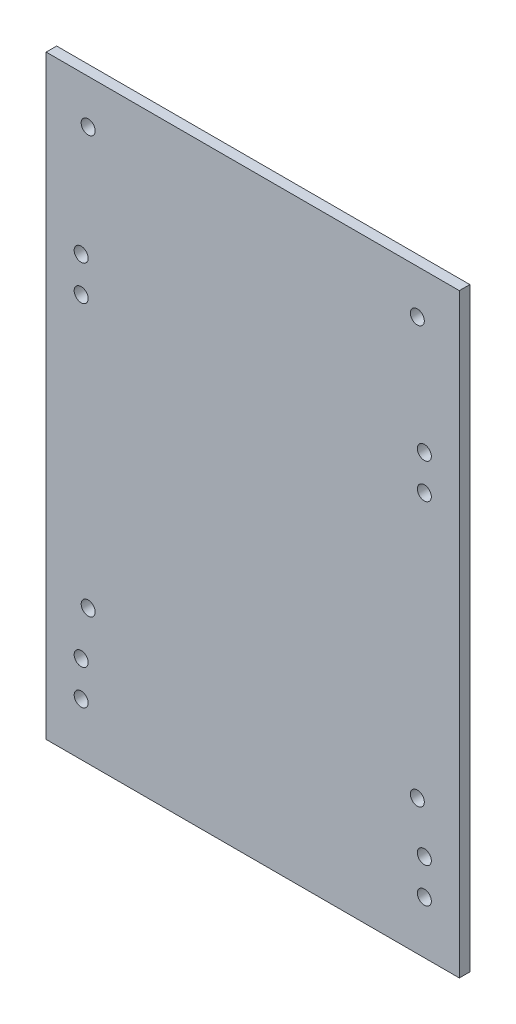
ISO-10303-21;
HEADER;
FILE_DESCRIPTION(('STEP AP214'),'2;1');
FILE_NAME('part.step','',(''),(''),'','','');
FILE_SCHEMA(('AUTOMOTIVE_DESIGN { 1 0 10303 214 1 1 1 1 }'));
ENDSEC;
DATA;
#1=APPLICATION_CONTEXT('core data for automotive mechanical design processes');
#2=APPLICATION_PROTOCOL_DEFINITION('international standard','automotive_design',2000,#1);
#3=PRODUCT_CONTEXT('',#1,'mechanical');
#4=PRODUCT('Part','Part','',(#3));
#5=PRODUCT_RELATED_PRODUCT_CATEGORY('part','',(#4));
#6=PRODUCT_DEFINITION_FORMATION('','',#4);
#7=PRODUCT_DEFINITION_CONTEXT('part definition',#1,'design');
#8=PRODUCT_DEFINITION('design','',#6,#7);
#9=PRODUCT_DEFINITION_SHAPE('','',#8);
#10=(LENGTH_UNIT() NAMED_UNIT(*) SI_UNIT(.MILLI.,.METRE.));
#11=(NAMED_UNIT(*) PLANE_ANGLE_UNIT() SI_UNIT($,.RADIAN.));
#12=(NAMED_UNIT(*) SI_UNIT($,.STERADIAN.) SOLID_ANGLE_UNIT());
#13=UNCERTAINTY_MEASURE_WITH_UNIT(LENGTH_MEASURE(1.E-05),#10,'distance_accuracy_value','');
#14=(GEOMETRIC_REPRESENTATION_CONTEXT(3) GLOBAL_UNCERTAINTY_ASSIGNED_CONTEXT((#13)) GLOBAL_UNIT_ASSIGNED_CONTEXT((#10,
#11,#12)) REPRESENTATION_CONTEXT('',''));
#15=CARTESIAN_POINT('',(0.,0.,0.));
#16=DIRECTION('',(0.,0.,1.));
#17=DIRECTION('',(1.,0.,0.));
#18=AXIS2_PLACEMENT_3D('',#15,#16,#17);
#19=CARTESIAN_POINT('',(0.,0.,3.));
#20=DIRECTION('',(0.,0.,1.));
#21=DIRECTION('',(1.,0.,0.));
#22=AXIS2_PLACEMENT_3D('',#19,#20,#21);
#23=PLANE('',#22);
#24=CARTESIAN_POINT('',(47.,-31.5,3.));
#25=DIRECTION('',(0.,0.,1.));
#26=DIRECTION('',(1.,0.,0.));
#27=AXIS2_PLACEMENT_3D('',#24,#25,#26);
#28=CIRCLE('',#27,2.);
#29=CARTESIAN_POINT('',(49.,-31.5,3.));
#30=VERTEX_POINT('',#29);
#31=EDGE_CURVE('E168',#30,#30,#28,.T.);
#32=ORIENTED_EDGE('',*,*,#31,.F.);
#33=EDGE_LOOP('',(#32));
#34=FACE_BOUND('',#33,.T.);
#35=CARTESIAN_POINT('',(-47.,87.5,3.));
#36=DIRECTION('',(0.,0.,1.));
#37=DIRECTION('',(1.,0.,0.));
#38=AXIS2_PLACEMENT_3D('',#35,#36,#37);
#39=CIRCLE('',#38,2.);
#40=CARTESIAN_POINT('',(-45.,87.5,3.));
#41=VERTEX_POINT('',#40);
#42=EDGE_CURVE('E156',#41,#41,#39,.T.);
#43=ORIENTED_EDGE('',*,*,#42,.F.);
#44=EDGE_LOOP('',(#43));
#45=FACE_BOUND('',#44,.T.);
#46=CARTESIAN_POINT('',(-49.,-45.,3.));
#47=DIRECTION('',(0.,0.,1.));
#48=DIRECTION('',(-1.,0.,0.));
#49=AXIS2_PLACEMENT_3D('',#46,#47,#48);
#50=CIRCLE('',#49,2.);
#51=CARTESIAN_POINT('',(-51.,-45.,3.));
#52=VERTEX_POINT('',#51);
#53=EDGE_CURVE('E144',#52,#52,#50,.T.);
#54=ORIENTED_EDGE('',*,*,#53,.F.);
#55=EDGE_LOOP('',(#54));
#56=FACE_BOUND('',#55,.T.);
#57=CARTESIAN_POINT('',(49.,-45.,3.));
#58=DIRECTION('',(0.,0.,1.));
#59=DIRECTION('',(1.,0.,0.));
#60=AXIS2_PLACEMENT_3D('',#57,#58,#59);
#61=CIRCLE('',#60,2.);
#62=CARTESIAN_POINT('',(51.,-45.,3.));
#63=VERTEX_POINT('',#62);
#64=EDGE_CURVE('E132',#63,#63,#61,.T.);
#65=ORIENTED_EDGE('',*,*,#64,.F.);
#66=EDGE_LOOP('',(#65));
#67=FACE_BOUND('',#66,.T.);
#68=CARTESIAN_POINT('',(49.,45.,3.));
#69=DIRECTION('',(0.,0.,1.));
#70=DIRECTION('',(-1.,0.,0.));
#71=AXIS2_PLACEMENT_3D('',#68,#69,#70);
#72=CIRCLE('',#71,2.);
#73=CARTESIAN_POINT('',(47.,45.,3.));
#74=VERTEX_POINT('',#73);
#75=EDGE_CURVE('E120',#74,#74,#72,.T.);
#76=ORIENTED_EDGE('',*,*,#75,.F.);
#77=EDGE_LOOP('',(#76));
#78=FACE_BOUND('',#77,.T.);
#79=CARTESIAN_POINT('',(-49.,55.,3.));
#80=DIRECTION('',(0.,0.,1.));
#81=DIRECTION('',(1.,0.,0.));
#82=AXIS2_PLACEMENT_3D('',#79,#80,#81);
#83=CIRCLE('',#82,2.);
#84=CARTESIAN_POINT('',(-47.,55.,3.));
#85=VERTEX_POINT('',#84);
#86=EDGE_CURVE('E99',#85,#85,#83,.T.);
#87=ORIENTED_EDGE('',*,*,#86,.F.);
#88=EDGE_LOOP('',(#87));
#89=FACE_BOUND('',#88,.T.);
#90=DIRECTION('',(0.,-1.,0.));
#91=VECTOR('',#90,1.);
#92=CARTESIAN_POINT('',(-59.,100.,3.));
#93=LINE('',#92,#91);
#94=CARTESIAN_POINT('',(-59.,100.,3.));
#95=VERTEX_POINT('',#94);
#96=CARTESIAN_POINT('',(-59.,-70.,3.));
#97=VERTEX_POINT('',#96);
#98=EDGE_CURVE('E84',#95,#97,#93,.T.);
#99=ORIENTED_EDGE('',*,*,#98,.T.);
#100=DIRECTION('',(1.,0.,0.));
#101=VECTOR('',#100,1.);
#102=CARTESIAN_POINT('',(-59.,-70.,3.));
#103=LINE('',#102,#101);
#104=CARTESIAN_POINT('',(59.,-70.,3.));
#105=VERTEX_POINT('',#104);
#106=EDGE_CURVE('E79',#97,#105,#103,.T.);
#107=ORIENTED_EDGE('',*,*,#106,.T.);
#108=DIRECTION('',(0.,1.,0.));
#109=VECTOR('',#108,1.);
#110=CARTESIAN_POINT('',(59.,100.,3.));
#111=LINE('',#110,#109);
#112=CARTESIAN_POINT('',(59.,100.,3.));
#113=VERTEX_POINT('',#112);
#114=EDGE_CURVE('E82',#105,#113,#111,.T.);
#115=ORIENTED_EDGE('',*,*,#114,.T.);
#116=DIRECTION('',(-1.,0.,0.));
#117=VECTOR('',#116,1.);
#118=CARTESIAN_POINT('',(-59.,100.,3.));
#119=LINE('',#118,#117);
#120=EDGE_CURVE('E49',#113,#95,#119,.T.);
#121=ORIENTED_EDGE('',*,*,#120,.T.);
#122=EDGE_LOOP('',(#99,#107,#115,#121));
#123=FACE_BOUND('',#122,.T.);
#124=CARTESIAN_POINT('',(-49.,45.,3.));
#125=DIRECTION('',(0.,0.,1.));
#126=DIRECTION('',(1.,0.,0.));
#127=AXIS2_PLACEMENT_3D('',#124,#125,#126);
#128=CIRCLE('',#127,2.);
#129=CARTESIAN_POINT('',(-47.,45.,3.));
#130=VERTEX_POINT('',#129);
#131=EDGE_CURVE('E114',#130,#130,#128,.T.);
#132=ORIENTED_EDGE('',*,*,#131,.F.);
#133=EDGE_LOOP('',(#132));
#134=FACE_BOUND('',#133,.T.);
#135=CARTESIAN_POINT('',(49.,55.,3.));
#136=DIRECTION('',(0.,0.,1.));
#137=DIRECTION('',(-1.,0.,0.));
#138=AXIS2_PLACEMENT_3D('',#135,#136,#137);
#139=CIRCLE('',#138,2.);
#140=CARTESIAN_POINT('',(47.,55.,3.));
#141=VERTEX_POINT('',#140);
#142=EDGE_CURVE('E126',#141,#141,#139,.T.);
#143=ORIENTED_EDGE('',*,*,#142,.F.);
#144=EDGE_LOOP('',(#143));
#145=FACE_BOUND('',#144,.T.);
#146=CARTESIAN_POINT('',(49.,-55.,3.));
#147=DIRECTION('',(0.,0.,1.));
#148=DIRECTION('',(1.,0.,0.));
#149=AXIS2_PLACEMENT_3D('',#146,#147,#148);
#150=CIRCLE('',#149,2.);
#151=CARTESIAN_POINT('',(51.,-55.,3.));
#152=VERTEX_POINT('',#151);
#153=EDGE_CURVE('E138',#152,#152,#150,.T.);
#154=ORIENTED_EDGE('',*,*,#153,.F.);
#155=EDGE_LOOP('',(#154));
#156=FACE_BOUND('',#155,.T.);
#157=CARTESIAN_POINT('',(-49.,-55.,3.));
#158=DIRECTION('',(0.,0.,1.));
#159=DIRECTION('',(-1.,0.,0.));
#160=AXIS2_PLACEMENT_3D('',#157,#158,#159);
#161=CIRCLE('',#160,2.);
#162=CARTESIAN_POINT('',(-51.,-55.,3.));
#163=VERTEX_POINT('',#162);
#164=EDGE_CURVE('E150',#163,#163,#161,.T.);
#165=ORIENTED_EDGE('',*,*,#164,.F.);
#166=EDGE_LOOP('',(#165));
#167=FACE_BOUND('',#166,.T.);
#168=CARTESIAN_POINT('',(47.,87.5,3.));
#169=DIRECTION('',(0.,0.,1.));
#170=DIRECTION('',(-1.,0.,0.));
#171=AXIS2_PLACEMENT_3D('',#168,#169,#170);
#172=CIRCLE('',#171,2.);
#173=CARTESIAN_POINT('',(45.,87.5,3.));
#174=VERTEX_POINT('',#173);
#175=EDGE_CURVE('E162',#174,#174,#172,.T.);
#176=ORIENTED_EDGE('',*,*,#175,.F.);
#177=EDGE_LOOP('',(#176));
#178=FACE_BOUND('',#177,.T.);
#179=CARTESIAN_POINT('',(-47.,-31.5,3.));
#180=DIRECTION('',(0.,0.,1.));
#181=DIRECTION('',(-1.,0.,0.));
#182=AXIS2_PLACEMENT_3D('',#179,#180,#181);
#183=CIRCLE('',#182,2.);
#184=CARTESIAN_POINT('',(-49.,-31.5,3.));
#185=VERTEX_POINT('',#184);
#186=EDGE_CURVE('E174',#185,#185,#183,.T.);
#187=ORIENTED_EDGE('',*,*,#186,.F.);
#188=EDGE_LOOP('',(#187));
#189=FACE_BOUND('',#188,.T.);
#190=ADVANCED_FACE('F32',(#34,#45,#56,#67,#78,#89,#123,#134,#145,#156,#167,#178,#189),#23,.T.);
#191=CARTESIAN_POINT('',(0.,0.,0.));
#192=DIRECTION('',(0.,0.,1.));
#193=DIRECTION('',(1.,0.,0.));
#194=AXIS2_PLACEMENT_3D('',#191,#192,#193);
#195=PLANE('',#194);
#196=DIRECTION('',(0.,-1.,0.));
#197=VECTOR('',#196,1.);
#198=CARTESIAN_POINT('',(-59.,100.,0.));
#199=LINE('',#198,#197);
#200=CARTESIAN_POINT('',(-59.,100.,0.));
#201=VERTEX_POINT('',#200);
#202=CARTESIAN_POINT('',(-59.,-70.,0.));
#203=VERTEX_POINT('',#202);
#204=EDGE_CURVE('E96',#201,#203,#199,.T.);
#205=ORIENTED_EDGE('',*,*,#204,.F.);
#206=DIRECTION('',(-1.,0.,0.));
#207=VECTOR('',#206,1.);
#208=CARTESIAN_POINT('',(-59.,100.,0.));
#209=LINE('',#208,#207);
#210=CARTESIAN_POINT('',(59.,100.,0.));
#211=VERTEX_POINT('',#210);
#212=EDGE_CURVE('E72',#211,#201,#209,.T.);
#213=ORIENTED_EDGE('',*,*,#212,.F.);
#214=DIRECTION('',(0.,1.,0.));
#215=VECTOR('',#214,1.);
#216=CARTESIAN_POINT('',(59.,100.,0.));
#217=LINE('',#216,#215);
#218=CARTESIAN_POINT('',(59.,-70.,0.));
#219=VERTEX_POINT('',#218);
#220=EDGE_CURVE('E66',#219,#211,#217,.T.);
#221=ORIENTED_EDGE('',*,*,#220,.F.);
#222=DIRECTION('',(1.,0.,0.));
#223=VECTOR('',#222,1.);
#224=CARTESIAN_POINT('',(-59.,-70.,0.));
#225=LINE('',#224,#223);
#226=EDGE_CURVE('E88',#203,#219,#225,.T.);
#227=ORIENTED_EDGE('',*,*,#226,.F.);
#228=EDGE_LOOP('',(#205,#213,#221,#227));
#229=FACE_BOUND('',#228,.T.);
#230=CARTESIAN_POINT('',(-49.,55.,0.));
#231=DIRECTION('',(0.,0.,1.));
#232=DIRECTION('',(1.,0.,0.));
#233=AXIS2_PLACEMENT_3D('',#230,#231,#232);
#234=CIRCLE('',#233,2.);
#235=CARTESIAN_POINT('',(-47.,55.,0.));
#236=VERTEX_POINT('',#235);
#237=EDGE_CURVE('E111',#236,#236,#234,.T.);
#238=ORIENTED_EDGE('',*,*,#237,.T.);
#239=EDGE_LOOP('',(#238));
#240=FACE_BOUND('',#239,.T.);
#241=CARTESIAN_POINT('',(-49.,45.,0.));
#242=DIRECTION('',(0.,0.,1.));
#243=DIRECTION('',(1.,0.,0.));
#244=AXIS2_PLACEMENT_3D('',#241,#242,#243);
#245=CIRCLE('',#244,2.);
#246=CARTESIAN_POINT('',(-47.,45.,0.));
#247=VERTEX_POINT('',#246);
#248=EDGE_CURVE('E117',#247,#247,#245,.T.);
#249=ORIENTED_EDGE('',*,*,#248,.T.);
#250=EDGE_LOOP('',(#249));
#251=FACE_BOUND('',#250,.T.);
#252=CARTESIAN_POINT('',(49.,45.,0.));
#253=DIRECTION('',(0.,0.,1.));
#254=DIRECTION('',(-1.,0.,0.));
#255=AXIS2_PLACEMENT_3D('',#252,#253,#254);
#256=CIRCLE('',#255,2.);
#257=CARTESIAN_POINT('',(47.,45.,0.));
#258=VERTEX_POINT('',#257);
#259=EDGE_CURVE('E123',#258,#258,#256,.T.);
#260=ORIENTED_EDGE('',*,*,#259,.T.);
#261=EDGE_LOOP('',(#260));
#262=FACE_BOUND('',#261,.T.);
#263=CARTESIAN_POINT('',(49.,55.,0.));
#264=DIRECTION('',(0.,0.,1.));
#265=DIRECTION('',(-1.,0.,0.));
#266=AXIS2_PLACEMENT_3D('',#263,#264,#265);
#267=CIRCLE('',#266,2.);
#268=CARTESIAN_POINT('',(47.,55.,0.));
#269=VERTEX_POINT('',#268);
#270=EDGE_CURVE('E129',#269,#269,#267,.T.);
#271=ORIENTED_EDGE('',*,*,#270,.T.);
#272=EDGE_LOOP('',(#271));
#273=FACE_BOUND('',#272,.T.);
#274=CARTESIAN_POINT('',(49.,-45.,0.));
#275=DIRECTION('',(0.,0.,1.));
#276=DIRECTION('',(1.,0.,0.));
#277=AXIS2_PLACEMENT_3D('',#274,#275,#276);
#278=CIRCLE('',#277,2.);
#279=CARTESIAN_POINT('',(51.,-45.,0.));
#280=VERTEX_POINT('',#279);
#281=EDGE_CURVE('E135',#280,#280,#278,.T.);
#282=ORIENTED_EDGE('',*,*,#281,.T.);
#283=EDGE_LOOP('',(#282));
#284=FACE_BOUND('',#283,.T.);
#285=CARTESIAN_POINT('',(49.,-55.,0.));
#286=DIRECTION('',(0.,0.,1.));
#287=DIRECTION('',(1.,0.,0.));
#288=AXIS2_PLACEMENT_3D('',#285,#286,#287);
#289=CIRCLE('',#288,2.);
#290=CARTESIAN_POINT('',(51.,-55.,0.));
#291=VERTEX_POINT('',#290);
#292=EDGE_CURVE('E141',#291,#291,#289,.T.);
#293=ORIENTED_EDGE('',*,*,#292,.T.);
#294=EDGE_LOOP('',(#293));
#295=FACE_BOUND('',#294,.T.);
#296=CARTESIAN_POINT('',(-49.,-45.,0.));
#297=DIRECTION('',(0.,0.,1.));
#298=DIRECTION('',(-1.,0.,0.));
#299=AXIS2_PLACEMENT_3D('',#296,#297,#298);
#300=CIRCLE('',#299,2.);
#301=CARTESIAN_POINT('',(-51.,-45.,0.));
#302=VERTEX_POINT('',#301);
#303=EDGE_CURVE('E147',#302,#302,#300,.T.);
#304=ORIENTED_EDGE('',*,*,#303,.T.);
#305=EDGE_LOOP('',(#304));
#306=FACE_BOUND('',#305,.T.);
#307=CARTESIAN_POINT('',(-49.,-55.,0.));
#308=DIRECTION('',(0.,0.,1.));
#309=DIRECTION('',(-1.,0.,0.));
#310=AXIS2_PLACEMENT_3D('',#307,#308,#309);
#311=CIRCLE('',#310,2.);
#312=CARTESIAN_POINT('',(-51.,-55.,0.));
#313=VERTEX_POINT('',#312);
#314=EDGE_CURVE('E153',#313,#313,#311,.T.);
#315=ORIENTED_EDGE('',*,*,#314,.T.);
#316=EDGE_LOOP('',(#315));
#317=FACE_BOUND('',#316,.T.);
#318=CARTESIAN_POINT('',(-47.,87.5,0.));
#319=DIRECTION('',(0.,0.,1.));
#320=DIRECTION('',(1.,0.,0.));
#321=AXIS2_PLACEMENT_3D('',#318,#319,#320);
#322=CIRCLE('',#321,2.);
#323=CARTESIAN_POINT('',(-45.,87.5,0.));
#324=VERTEX_POINT('',#323);
#325=EDGE_CURVE('E159',#324,#324,#322,.T.);
#326=ORIENTED_EDGE('',*,*,#325,.T.);
#327=EDGE_LOOP('',(#326));
#328=FACE_BOUND('',#327,.T.);
#329=CARTESIAN_POINT('',(47.,87.5,0.));
#330=DIRECTION('',(0.,0.,1.));
#331=DIRECTION('',(-1.,0.,0.));
#332=AXIS2_PLACEMENT_3D('',#329,#330,#331);
#333=CIRCLE('',#332,2.);
#334=CARTESIAN_POINT('',(45.,87.5,0.));
#335=VERTEX_POINT('',#334);
#336=EDGE_CURVE('E165',#335,#335,#333,.T.);
#337=ORIENTED_EDGE('',*,*,#336,.T.);
#338=EDGE_LOOP('',(#337));
#339=FACE_BOUND('',#338,.T.);
#340=CARTESIAN_POINT('',(47.,-31.5,0.));
#341=DIRECTION('',(0.,0.,1.));
#342=DIRECTION('',(1.,0.,0.));
#343=AXIS2_PLACEMENT_3D('',#340,#341,#342);
#344=CIRCLE('',#343,2.);
#345=CARTESIAN_POINT('',(49.,-31.5,0.));
#346=VERTEX_POINT('',#345);
#347=EDGE_CURVE('E171',#346,#346,#344,.T.);
#348=ORIENTED_EDGE('',*,*,#347,.T.);
#349=EDGE_LOOP('',(#348));
#350=FACE_BOUND('',#349,.T.);
#351=CARTESIAN_POINT('',(-47.,-31.5,0.));
#352=DIRECTION('',(0.,0.,1.));
#353=DIRECTION('',(-1.,0.,0.));
#354=AXIS2_PLACEMENT_3D('',#351,#352,#353);
#355=CIRCLE('',#354,2.);
#356=CARTESIAN_POINT('',(-49.,-31.5,0.));
#357=VERTEX_POINT('',#356);
#358=EDGE_CURVE('E177',#357,#357,#355,.T.);
#359=ORIENTED_EDGE('',*,*,#358,.T.);
#360=EDGE_LOOP('',(#359));
#361=FACE_BOUND('',#360,.T.);
#362=ADVANCED_FACE('F107',(#229,#240,#251,#262,#273,#284,#295,#306,#317,#328,#339,#350,#361),
#195,.F.);
#363=CARTESIAN_POINT('',(-59.,100.,3.));
#364=DIRECTION('',(1.,0.,0.));
#365=DIRECTION('',(0.,1.,0.));
#366=AXIS2_PLACEMENT_3D('',#363,#364,#365);
#367=PLANE('',#366);
#368=ORIENTED_EDGE('',*,*,#204,.T.);
#369=DIRECTION('',(0.,0.,-1.));
#370=VECTOR('',#369,1.);
#371=CARTESIAN_POINT('',(-59.,-70.,3.));
#372=LINE('',#371,#370);
#373=EDGE_CURVE('E11',#97,#203,#372,.T.);
#374=ORIENTED_EDGE('',*,*,#373,.F.);
#375=ORIENTED_EDGE('',*,*,#98,.F.);
#376=DIRECTION('',(0.,0.,-1.));
#377=VECTOR('',#376,1.);
#378=CARTESIAN_POINT('',(-59.,100.,3.));
#379=LINE('',#378,#377);
#380=EDGE_CURVE('E92',#95,#201,#379,.T.);
#381=ORIENTED_EDGE('',*,*,#380,.T.);
#382=EDGE_LOOP('',(#368,#374,#375,#381));
#383=FACE_BOUND('',#382,.T.);
#384=ADVANCED_FACE('F34',(#383),#367,.F.);
#385=CARTESIAN_POINT('',(-59.,-70.,3.));
#386=DIRECTION('',(0.,1.,0.));
#387=DIRECTION('',(0.,0.,1.));
#388=AXIS2_PLACEMENT_3D('',#385,#386,#387);
#389=PLANE('',#388);
#390=ORIENTED_EDGE('',*,*,#226,.T.);
#391=DIRECTION('',(0.,0.,-1.));
#392=VECTOR('',#391,1.);
#393=CARTESIAN_POINT('',(59.,-70.,3.));
#394=LINE('',#393,#392);
#395=EDGE_CURVE('E41',#105,#219,#394,.T.);
#396=ORIENTED_EDGE('',*,*,#395,.F.);
#397=ORIENTED_EDGE('',*,*,#106,.F.);
#398=ORIENTED_EDGE('',*,*,#373,.T.);
#399=EDGE_LOOP('',(#390,#396,#397,#398));
#400=FACE_BOUND('',#399,.T.);
#401=ADVANCED_FACE('F87',(#400),#389,.F.);
#402=CARTESIAN_POINT('',(59.,100.,3.));
#403=DIRECTION('',(-1.,0.,0.));
#404=DIRECTION('',(0.,-1.,0.));
#405=AXIS2_PLACEMENT_3D('',#402,#403,#404);
#406=PLANE('',#405);
#407=ORIENTED_EDGE('',*,*,#220,.T.);
#408=DIRECTION('',(0.,0.,-1.));
#409=VECTOR('',#408,1.);
#410=CARTESIAN_POINT('',(59.,100.,3.));
#411=LINE('',#410,#409);
#412=EDGE_CURVE('E89',#113,#211,#411,.T.);
#413=ORIENTED_EDGE('',*,*,#412,.F.);
#414=ORIENTED_EDGE('',*,*,#114,.F.);
#415=ORIENTED_EDGE('',*,*,#395,.T.);
#416=EDGE_LOOP('',(#407,#413,#414,#415));
#417=FACE_BOUND('',#416,.T.);
#418=ADVANCED_FACE('F90',(#417),#406,.F.);
#419=CARTESIAN_POINT('',(-59.,100.,3.));
#420=DIRECTION('',(0.,-1.,0.));
#421=DIRECTION('',(0.,0.,-1.));
#422=AXIS2_PLACEMENT_3D('',#419,#420,#421);
#423=PLANE('',#422);
#424=ORIENTED_EDGE('',*,*,#212,.T.);
#425=ORIENTED_EDGE('',*,*,#380,.F.);
#426=ORIENTED_EDGE('',*,*,#120,.F.);
#427=ORIENTED_EDGE('',*,*,#412,.T.);
#428=EDGE_LOOP('',(#424,#425,#426,#427));
#429=FACE_BOUND('',#428,.T.);
#430=ADVANCED_FACE('F104',(#429),#423,.F.);
#431=CARTESIAN_POINT('',(-49.,55.,3.));
#432=DIRECTION('',(0.,0.,-1.));
#433=DIRECTION('',(-1.,0.,0.));
#434=AXIS2_PLACEMENT_3D('',#431,#432,#433);
#435=CYLINDRICAL_SURFACE('',#434,2.);
#436=ORIENTED_EDGE('',*,*,#86,.T.);
#437=EDGE_LOOP('',(#436));
#438=FACE_BOUND('',#437,.T.);
#439=ORIENTED_EDGE('',*,*,#237,.F.);
#440=EDGE_LOOP('',(#439));
#441=FACE_BOUND('',#440,.T.);
#442=ADVANCED_FACE('F196',(#438,#441),#435,.F.);
#443=CARTESIAN_POINT('',(-49.,45.,3.));
#444=DIRECTION('',(0.,0.,-1.));
#445=DIRECTION('',(-1.,0.,0.));
#446=AXIS2_PLACEMENT_3D('',#443,#444,#445);
#447=CYLINDRICAL_SURFACE('',#446,2.);
#448=ORIENTED_EDGE('',*,*,#131,.T.);
#449=EDGE_LOOP('',(#448));
#450=FACE_BOUND('',#449,.T.);
#451=ORIENTED_EDGE('',*,*,#248,.F.);
#452=EDGE_LOOP('',(#451));
#453=FACE_BOUND('',#452,.T.);
#454=ADVANCED_FACE('F242',(#450,#453),#447,.F.);
#455=CARTESIAN_POINT('',(49.,45.,3.));
#456=DIRECTION('',(0.,0.,-1.));
#457=DIRECTION('',(-1.,0.,0.));
#458=AXIS2_PLACEMENT_3D('',#455,#456,#457);
#459=CYLINDRICAL_SURFACE('',#458,2.);
#460=ORIENTED_EDGE('',*,*,#75,.T.);
#461=EDGE_LOOP('',(#460));
#462=FACE_BOUND('',#461,.T.);
#463=ORIENTED_EDGE('',*,*,#259,.F.);
#464=EDGE_LOOP('',(#463));
#465=FACE_BOUND('',#464,.T.);
#466=ADVANCED_FACE('F250',(#462,#465),#459,.F.);
#467=CARTESIAN_POINT('',(49.,55.,3.));
#468=DIRECTION('',(0.,0.,-1.));
#469=DIRECTION('',(-1.,0.,0.));
#470=AXIS2_PLACEMENT_3D('',#467,#468,#469);
#471=CYLINDRICAL_SURFACE('',#470,2.);
#472=ORIENTED_EDGE('',*,*,#142,.T.);
#473=EDGE_LOOP('',(#472));
#474=FACE_BOUND('',#473,.T.);
#475=ORIENTED_EDGE('',*,*,#270,.F.);
#476=EDGE_LOOP('',(#475));
#477=FACE_BOUND('',#476,.T.);
#478=ADVANCED_FACE('F258',(#474,#477),#471,.F.);
#479=CARTESIAN_POINT('',(49.,-45.,3.));
#480=DIRECTION('',(0.,0.,-1.));
#481=DIRECTION('',(-1.,0.,0.));
#482=AXIS2_PLACEMENT_3D('',#479,#480,#481);
#483=CYLINDRICAL_SURFACE('',#482,2.);
#484=ORIENTED_EDGE('',*,*,#64,.T.);
#485=EDGE_LOOP('',(#484));
#486=FACE_BOUND('',#485,.T.);
#487=ORIENTED_EDGE('',*,*,#281,.F.);
#488=EDGE_LOOP('',(#487));
#489=FACE_BOUND('',#488,.T.);
#490=ADVANCED_FACE('F267',(#486,#489),#483,.F.);
#491=CARTESIAN_POINT('',(49.,-55.,3.));
#492=DIRECTION('',(0.,0.,-1.));
#493=DIRECTION('',(-1.,0.,0.));
#494=AXIS2_PLACEMENT_3D('',#491,#492,#493);
#495=CYLINDRICAL_SURFACE('',#494,2.);
#496=ORIENTED_EDGE('',*,*,#153,.T.);
#497=EDGE_LOOP('',(#496));
#498=FACE_BOUND('',#497,.T.);
#499=ORIENTED_EDGE('',*,*,#292,.F.);
#500=EDGE_LOOP('',(#499));
#501=FACE_BOUND('',#500,.T.);
#502=ADVANCED_FACE('F276',(#498,#501),#495,.F.);
#503=CARTESIAN_POINT('',(-49.,-45.,3.));
#504=DIRECTION('',(0.,0.,-1.));
#505=DIRECTION('',(-1.,0.,0.));
#506=AXIS2_PLACEMENT_3D('',#503,#504,#505);
#507=CYLINDRICAL_SURFACE('',#506,2.);
#508=ORIENTED_EDGE('',*,*,#53,.T.);
#509=EDGE_LOOP('',(#508));
#510=FACE_BOUND('',#509,.T.);
#511=ORIENTED_EDGE('',*,*,#303,.F.);
#512=EDGE_LOOP('',(#511));
#513=FACE_BOUND('',#512,.T.);
#514=ADVANCED_FACE('F285',(#510,#513),#507,.F.);
#515=CARTESIAN_POINT('',(-49.,-55.,3.));
#516=DIRECTION('',(0.,0.,-1.));
#517=DIRECTION('',(-1.,0.,0.));
#518=AXIS2_PLACEMENT_3D('',#515,#516,#517);
#519=CYLINDRICAL_SURFACE('',#518,2.);
#520=ORIENTED_EDGE('',*,*,#164,.T.);
#521=EDGE_LOOP('',(#520));
#522=FACE_BOUND('',#521,.T.);
#523=ORIENTED_EDGE('',*,*,#314,.F.);
#524=EDGE_LOOP('',(#523));
#525=FACE_BOUND('',#524,.T.);
#526=ADVANCED_FACE('F294',(#522,#525),#519,.F.);
#527=CARTESIAN_POINT('',(-47.,87.5,3.));
#528=DIRECTION('',(0.,0.,-1.));
#529=DIRECTION('',(-1.,0.,0.));
#530=AXIS2_PLACEMENT_3D('',#527,#528,#529);
#531=CYLINDRICAL_SURFACE('',#530,2.);
#532=ORIENTED_EDGE('',*,*,#42,.T.);
#533=EDGE_LOOP('',(#532));
#534=FACE_BOUND('',#533,.T.);
#535=ORIENTED_EDGE('',*,*,#325,.F.);
#536=EDGE_LOOP('',(#535));
#537=FACE_BOUND('',#536,.T.);
#538=ADVANCED_FACE('F303',(#534,#537),#531,.F.);
#539=CARTESIAN_POINT('',(47.,87.5,3.));
#540=DIRECTION('',(0.,0.,-1.));
#541=DIRECTION('',(-1.,0.,0.));
#542=AXIS2_PLACEMENT_3D('',#539,#540,#541);
#543=CYLINDRICAL_SURFACE('',#542,2.);
#544=ORIENTED_EDGE('',*,*,#175,.T.);
#545=EDGE_LOOP('',(#544));
#546=FACE_BOUND('',#545,.T.);
#547=ORIENTED_EDGE('',*,*,#336,.F.);
#548=EDGE_LOOP('',(#547));
#549=FACE_BOUND('',#548,.T.);
#550=ADVANCED_FACE('F312',(#546,#549),#543,.F.);
#551=CARTESIAN_POINT('',(47.,-31.5,3.));
#552=DIRECTION('',(0.,0.,-1.));
#553=DIRECTION('',(-1.,0.,0.));
#554=AXIS2_PLACEMENT_3D('',#551,#552,#553);
#555=CYLINDRICAL_SURFACE('',#554,2.);
#556=ORIENTED_EDGE('',*,*,#31,.T.);
#557=EDGE_LOOP('',(#556));
#558=FACE_BOUND('',#557,.T.);
#559=ORIENTED_EDGE('',*,*,#347,.F.);
#560=EDGE_LOOP('',(#559));
#561=FACE_BOUND('',#560,.T.);
#562=ADVANCED_FACE('F321',(#558,#561),#555,.F.);
#563=CARTESIAN_POINT('',(-47.,-31.5,3.));
#564=DIRECTION('',(0.,0.,-1.));
#565=DIRECTION('',(-1.,0.,0.));
#566=AXIS2_PLACEMENT_3D('',#563,#564,#565);
#567=CYLINDRICAL_SURFACE('',#566,2.);
#568=ORIENTED_EDGE('',*,*,#186,.T.);
#569=EDGE_LOOP('',(#568));
#570=FACE_BOUND('',#569,.T.);
#571=ORIENTED_EDGE('',*,*,#358,.F.);
#572=EDGE_LOOP('',(#571));
#573=FACE_BOUND('',#572,.T.);
#574=ADVANCED_FACE('F183',(#570,#573),#567,.F.);
#575=CLOSED_SHELL('',(#190,#362,#384,#401,#418,#430,#442,#454,#466,#478,#490,#502,#514,#526,
#538,#550,#562,#574));
#576=MANIFOLD_SOLID_BREP('B2',#575);
#577=ADVANCED_BREP_SHAPE_REPRESENTATION('',(#18,#576),#14);
#578=SHAPE_DEFINITION_REPRESENTATION(#9,#577);
ENDSEC;
END-ISO-10303-21;
